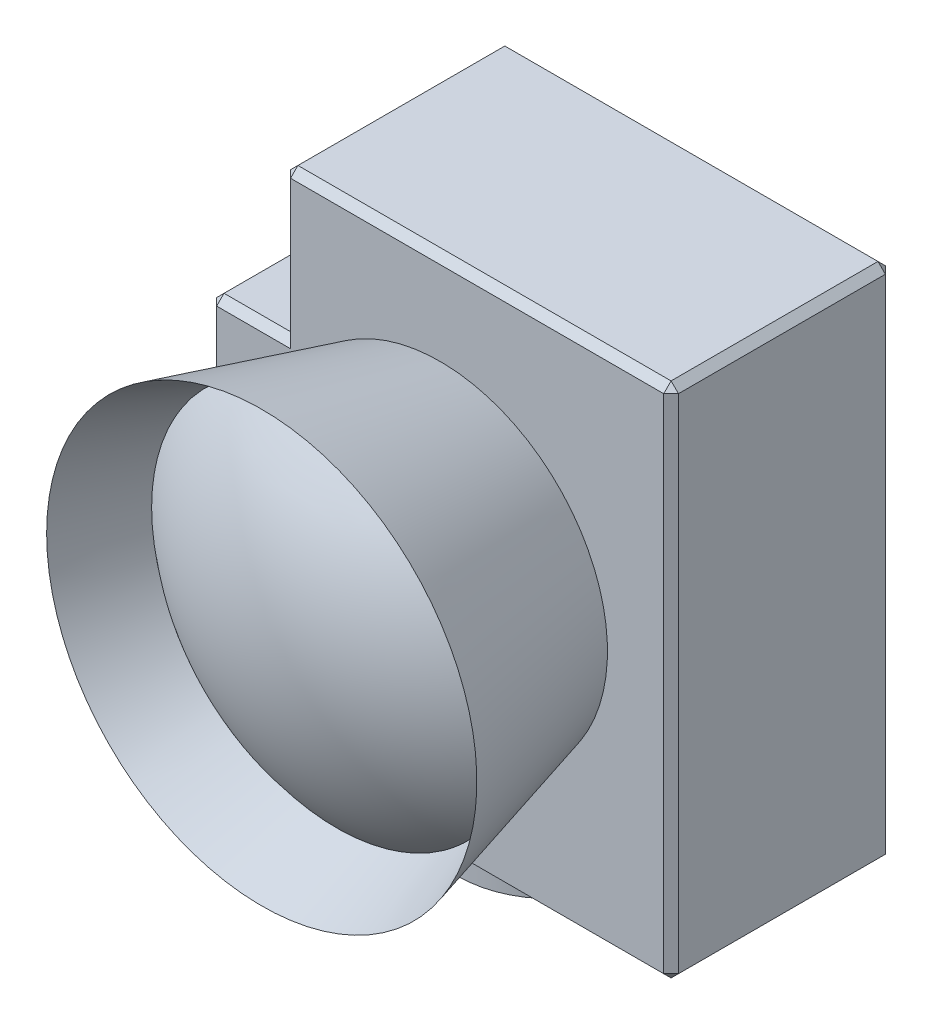
ISO-10303-21;
HEADER;
FILE_DESCRIPTION(('STEP AP214'),'2;1');
FILE_NAME('part.step','',(''),(''),'','','');
FILE_SCHEMA(('AUTOMOTIVE_DESIGN { 1 0 10303 214 1 1 1 1 }'));
ENDSEC;
DATA;
#1=APPLICATION_CONTEXT('core data for automotive mechanical design processes');
#2=APPLICATION_PROTOCOL_DEFINITION('international standard','automotive_design',2000,#1);
#3=PRODUCT_CONTEXT('',#1,'mechanical');
#4=PRODUCT('Part','Part','',(#3));
#5=PRODUCT_RELATED_PRODUCT_CATEGORY('part','',(#4));
#6=PRODUCT_DEFINITION_FORMATION('','',#4);
#7=PRODUCT_DEFINITION_CONTEXT('part definition',#1,'design');
#8=PRODUCT_DEFINITION('design','',#6,#7);
#9=PRODUCT_DEFINITION_SHAPE('','',#8);
#10=(LENGTH_UNIT() NAMED_UNIT(*) SI_UNIT(.MILLI.,.METRE.));
#11=(NAMED_UNIT(*) PLANE_ANGLE_UNIT() SI_UNIT($,.RADIAN.));
#12=(NAMED_UNIT(*) SI_UNIT($,.STERADIAN.) SOLID_ANGLE_UNIT());
#13=UNCERTAINTY_MEASURE_WITH_UNIT(LENGTH_MEASURE(1.E-05),#10,'distance_accuracy_value','');
#14=(GEOMETRIC_REPRESENTATION_CONTEXT(3) GLOBAL_UNCERTAINTY_ASSIGNED_CONTEXT((#13)) GLOBAL_UNIT_ASSIGNED_CONTEXT((#10,
#11,#12)) REPRESENTATION_CONTEXT('',''));
#15=CARTESIAN_POINT('',(0.,0.,0.));
#16=DIRECTION('',(0.,0.,1.));
#17=DIRECTION('',(1.,0.,0.));
#18=AXIS2_PLACEMENT_3D('',#15,#16,#17);
#19=CARTESIAN_POINT('',(0.,0.,33.7501562772454));
#20=CARTESIAN_POINT('',(-12.5291399374517,0.,33.7501562772454));
#21=CARTESIAN_POINT('',(-25.0582798749034,0.,28.9933194314533));
#22=B_SPLINE_CURVE_WITH_KNOTS('',2,(#19,#20,#21),.UNSPECIFIED.,.F.,.F.,(3,3),(0.,0.5),.UNSPECIFIED.);
#23=CARTESIAN_POINT('',(0.,0.,0.));
#24=DIRECTION('',(0.,0.,-1.));
#25=AXIS1_PLACEMENT('',#23,#24);
#26=SURFACE_OF_REVOLUTION('',#22,#25);
#27=CARTESIAN_POINT('',(0.,0.,28.9933194314533));
#28=DIRECTION('',(0.,0.,-1.));
#29=DIRECTION('',(-1.,0.,0.));
#30=AXIS2_PLACEMENT_3D('',#27,#28,#29);
#31=CIRCLE('',#30,25.0582798749034);
#32=CARTESIAN_POINT('',(-25.0582798749034,0.,28.9933194314533));
#33=VERTEX_POINT('',#32);
#34=EDGE_CURVE('E12',#33,#33,#31,.T.);
#35=ORIENTED_EDGE('',*,*,#34,.T.);
#36=EDGE_LOOP('',(#35));
#37=FACE_BOUND('',#36,.T.);
#38=CARTESIAN_POINT('',(0.,0.,33.7501562772454));
#39=VERTEX_POINT('',#38);
#40=VERTEX_LOOP('',#39);
#41=FACE_BOUND('',#40,.T.);
#42=ADVANCED_FACE('F49',(#37,#41),#26,.F.);
#43=CARTESIAN_POINT('',(0.,0.,0.));
#44=DIRECTION('',(0.,0.,-1.));
#45=DIRECTION('',(-1.,0.,0.));
#46=AXIS2_PLACEMENT_3D('',#43,#44,#45);
#47=SPHERICAL_SURFACE('',#46,38.3214034443322);
#48=ORIENTED_EDGE('',*,*,#34,.F.);
#49=EDGE_LOOP('',(#48));
#50=FACE_BOUND('',#49,.T.);
#51=ADVANCED_FACE('F58',(#50),#47,.T.);
#52=CLOSED_SHELL('',(#42,#51));
#53=MANIFOLD_SOLID_BREP('B2',#52);
#54=CARTESIAN_POINT('',(-31.25,15.,15.));
#55=DIRECTION('',(1.,0.,0.));
#56=DIRECTION('',(0.,1.,0.));
#57=AXIS2_PLACEMENT_3D('',#54,#55,#56);
#58=PLANE('',#57);
#59=DIRECTION('',(0.,0.,-1.));
#60=VECTOR('',#59,1.);
#61=CARTESIAN_POINT('',(-31.25,14.,15.));
#62=LINE('',#61,#60);
#63=CARTESIAN_POINT('',(-31.25,14.,14.));
#64=VERTEX_POINT('',#63);
#65=CARTESIAN_POINT('',(-31.25,14.,-14.));
#66=VERTEX_POINT('',#65);
#67=EDGE_CURVE('E98',#64,#66,#62,.T.);
#68=ORIENTED_EDGE('',*,*,#67,.T.);
#69=DIRECTION('',(0.,-1.,0.));
#70=VECTOR('',#69,1.);
#71=CARTESIAN_POINT('',(-31.25,-35.,-14.));
#72=LINE('',#71,#70);
#73=CARTESIAN_POINT('',(-31.25,-35.,-14.));
#74=VERTEX_POINT('',#73);
#75=EDGE_CURVE('E47',#66,#74,#72,.T.);
#76=ORIENTED_EDGE('',*,*,#75,.T.);
#77=DIRECTION('',(0.,0.,-1.));
#78=VECTOR('',#77,1.);
#79=CARTESIAN_POINT('',(-31.25,-35.,15.));
#80=LINE('',#79,#78);
#81=CARTESIAN_POINT('',(-31.25,-35.,14.));
#82=VERTEX_POINT('',#81);
#83=EDGE_CURVE('E374',#82,#74,#80,.T.);
#84=ORIENTED_EDGE('',*,*,#83,.F.);
#85=DIRECTION('',(0.,1.,0.));
#86=VECTOR('',#85,1.);
#87=CARTESIAN_POINT('',(-31.25,15.,14.));
#88=LINE('',#87,#86);
#89=EDGE_CURVE('E109',#82,#64,#88,.T.);
#90=ORIENTED_EDGE('',*,*,#89,.T.);
#91=EDGE_LOOP('',(#68,#76,#84,#90));
#92=FACE_BOUND('',#91,.T.);
#93=ADVANCED_FACE('F88',(#92),#58,.F.);
#94=CARTESIAN_POINT('',(31.25,-35.,15.));
#95=DIRECTION('',(0.,1.,0.));
#96=DIRECTION('',(0.,0.,1.));
#97=AXIS2_PLACEMENT_3D('',#94,#95,#96);
#98=PLANE('',#97);
#99=CARTESIAN_POINT('',(0.,-35.,0.));
#100=DIRECTION('',(0.,1.,0.));
#101=DIRECTION('',(0.,0.,1.));
#102=AXIS2_PLACEMENT_3D('',#99,#100,#101);
#103=CIRCLE('',#102,12.5);
#104=CARTESIAN_POINT('',(0.,-35.,12.5));
#105=VERTEX_POINT('',#104);
#106=EDGE_CURVE('E232',#105,#105,#103,.F.);
#107=ORIENTED_EDGE('',*,*,#106,.F.);
#108=EDGE_LOOP('',(#107));
#109=FACE_BOUND('',#108,.T.);
#110=ORIENTED_EDGE('',*,*,#83,.T.);
#111=DIRECTION('',(1.,0.,0.));
#112=VECTOR('',#111,1.);
#113=CARTESIAN_POINT('',(31.25,-35.,-14.));
#114=LINE('',#113,#112);
#115=CARTESIAN_POINT('',(30.25,-35.,-14.));
#116=VERTEX_POINT('',#115);
#117=EDGE_CURVE('E245',#74,#116,#114,.T.);
#118=ORIENTED_EDGE('',*,*,#117,.T.);
#119=DIRECTION('',(0.,0.,1.));
#120=VECTOR('',#119,1.);
#121=CARTESIAN_POINT('',(30.25,-35.,15.));
#122=LINE('',#121,#120);
#123=CARTESIAN_POINT('',(30.25,-35.,14.));
#124=VERTEX_POINT('',#123);
#125=EDGE_CURVE('E208',#116,#124,#122,.T.);
#126=ORIENTED_EDGE('',*,*,#125,.T.);
#127=DIRECTION('',(-1.,0.,0.));
#128=VECTOR('',#127,1.);
#129=CARTESIAN_POINT('',(31.25,-35.,14.));
#130=LINE('',#129,#128);
#131=EDGE_CURVE('E239',#124,#82,#130,.T.);
#132=ORIENTED_EDGE('',*,*,#131,.T.);
#133=EDGE_LOOP('',(#110,#118,#126,#132));
#134=FACE_BOUND('',#133,.T.);
#135=ADVANCED_FACE('F386',(#109,#134),#98,.F.);
#136=CARTESIAN_POINT('',(31.25,34.9819920704579,15.));
#137=DIRECTION('',(-1.,0.,0.));
#138=DIRECTION('',(0.,-1.,0.));
#139=AXIS2_PLACEMENT_3D('',#136,#137,#138);
#140=PLANE('',#139);
#141=DIRECTION('',(0.,0.,1.));
#142=VECTOR('',#141,1.);
#143=CARTESIAN_POINT('',(31.25,33.9819920704579,15.));
#144=LINE('',#143,#142);
#145=CARTESIAN_POINT('',(31.25,33.9819920704579,-14.));
#146=VERTEX_POINT('',#145);
#147=CARTESIAN_POINT('',(31.25,33.9819920704579,14.));
#148=VERTEX_POINT('',#147);
#149=EDGE_CURVE('E231',#146,#148,#144,.T.);
#150=ORIENTED_EDGE('',*,*,#149,.T.);
#151=DIRECTION('',(0.,-1.,0.));
#152=VECTOR('',#151,1.);
#153=CARTESIAN_POINT('',(31.25,34.9819920704579,14.));
#154=LINE('',#153,#152);
#155=CARTESIAN_POINT('',(31.25,-34.,14.));
#156=VERTEX_POINT('',#155);
#157=EDGE_CURVE('E236',#148,#156,#154,.T.);
#158=ORIENTED_EDGE('',*,*,#157,.T.);
#159=DIRECTION('',(0.,0.,-1.));
#160=VECTOR('',#159,1.);
#161=CARTESIAN_POINT('',(31.25,-34.,15.));
#162=LINE('',#161,#160);
#163=CARTESIAN_POINT('',(31.25,-34.,-14.));
#164=VERTEX_POINT('',#163);
#165=EDGE_CURVE('E206',#156,#164,#162,.T.);
#166=ORIENTED_EDGE('',*,*,#165,.T.);
#167=DIRECTION('',(0.,1.,0.));
#168=VECTOR('',#167,1.);
#169=CARTESIAN_POINT('',(31.25,34.9819920704579,-14.));
#170=LINE('',#169,#168);
#171=EDGE_CURVE('E225',#164,#146,#170,.T.);
#172=ORIENTED_EDGE('',*,*,#171,.T.);
#173=EDGE_LOOP('',(#150,#158,#166,#172));
#174=FACE_BOUND('',#173,.T.);
#175=ADVANCED_FACE('F234',(#174),#140,.F.);
#176=CARTESIAN_POINT('',(31.25,34.9819920704579,15.));
#177=DIRECTION('',(0.,-1.,0.));
#178=DIRECTION('',(1.,0.,0.));
#179=AXIS2_PLACEMENT_3D('',#176,#177,#178);
#180=PLANE('',#179);
#181=DIRECTION('',(1.,0.,0.));
#182=VECTOR('',#181,1.);
#183=CARTESIAN_POINT('',(31.25,34.9819920704579,14.));
#184=LINE('',#183,#182);
#185=CARTESIAN_POINT('',(-20.25,34.9819920704579,14.));
#186=VERTEX_POINT('',#185);
#187=CARTESIAN_POINT('',(30.25,34.9819920704579,14.));
#188=VERTEX_POINT('',#187);
#189=EDGE_CURVE('E247',#186,#188,#184,.T.);
#190=ORIENTED_EDGE('',*,*,#189,.T.);
#191=DIRECTION('',(0.,0.,-1.));
#192=VECTOR('',#191,1.);
#193=CARTESIAN_POINT('',(30.25,34.9819920704579,15.));
#194=LINE('',#193,#192);
#195=CARTESIAN_POINT('',(30.25,34.9819920704579,-14.));
#196=VERTEX_POINT('',#195);
#197=EDGE_CURVE('E253',#188,#196,#194,.T.);
#198=ORIENTED_EDGE('',*,*,#197,.T.);
#199=DIRECTION('',(-1.,0.,0.));
#200=VECTOR('',#199,1.);
#201=CARTESIAN_POINT('',(-21.25,34.9819920704579,-14.));
#202=LINE('',#201,#200);
#203=CARTESIAN_POINT('',(-20.25,34.9819920704579,-14.));
#204=VERTEX_POINT('',#203);
#205=EDGE_CURVE('E251',#196,#204,#202,.T.);
#206=ORIENTED_EDGE('',*,*,#205,.T.);
#207=DIRECTION('',(0.,0.,1.));
#208=VECTOR('',#207,1.);
#209=CARTESIAN_POINT('',(-20.25,34.9819920704579,15.));
#210=LINE('',#209,#208);
#211=EDGE_CURVE('E249',#204,#186,#210,.T.);
#212=ORIENTED_EDGE('',*,*,#211,.T.);
#213=EDGE_LOOP('',(#190,#198,#206,#212));
#214=FACE_BOUND('',#213,.T.);
#215=ADVANCED_FACE('F465',(#214),#180,.F.);
#216=CARTESIAN_POINT('',(-21.25,34.9819920704579,15.));
#217=DIRECTION('',(1.,0.,0.));
#218=DIRECTION('',(0.,0.,-1.));
#219=AXIS2_PLACEMENT_3D('',#216,#217,#218);
#220=PLANE('',#219);
#221=DIRECTION('',(0.,0.,-1.));
#222=VECTOR('',#221,1.);
#223=CARTESIAN_POINT('',(-21.25,33.9819920704579,15.));
#224=LINE('',#223,#222);
#225=CARTESIAN_POINT('',(-21.25,33.9819920704579,14.));
#226=VERTEX_POINT('',#225);
#227=CARTESIAN_POINT('',(-21.25,33.9819920704579,-14.));
#228=VERTEX_POINT('',#227);
#229=EDGE_CURVE('E291',#226,#228,#224,.T.);
#230=ORIENTED_EDGE('',*,*,#229,.T.);
#231=DIRECTION('',(0.,-1.,0.));
#232=VECTOR('',#231,1.);
#233=CARTESIAN_POINT('',(-21.25,15.,-14.));
#234=LINE('',#233,#232);
#235=CARTESIAN_POINT('',(-21.25,15.,-14.));
#236=VERTEX_POINT('',#235);
#237=EDGE_CURVE('E293',#228,#236,#234,.T.);
#238=ORIENTED_EDGE('',*,*,#237,.T.);
#239=DIRECTION('',(0.,0.,-1.));
#240=VECTOR('',#239,1.);
#241=CARTESIAN_POINT('',(-21.25,15.,15.));
#242=LINE('',#241,#240);
#243=CARTESIAN_POINT('',(-21.25,15.,14.));
#244=VERTEX_POINT('',#243);
#245=EDGE_CURVE('E369',#244,#236,#242,.T.);
#246=ORIENTED_EDGE('',*,*,#245,.F.);
#247=DIRECTION('',(0.,1.,0.));
#248=VECTOR('',#247,1.);
#249=CARTESIAN_POINT('',(-21.25,34.9819920704579,14.));
#250=LINE('',#249,#248);
#251=EDGE_CURVE('E289',#244,#226,#250,.T.);
#252=ORIENTED_EDGE('',*,*,#251,.T.);
#253=EDGE_LOOP('',(#230,#238,#246,#252));
#254=FACE_BOUND('',#253,.T.);
#255=ADVANCED_FACE('F478',(#254),#220,.F.);
#256=CARTESIAN_POINT('',(-31.25,15.,15.));
#257=DIRECTION('',(0.,-1.,0.));
#258=DIRECTION('',(1.,0.,0.));
#259=AXIS2_PLACEMENT_3D('',#256,#257,#258);
#260=PLANE('',#259);
#261=ORIENTED_EDGE('',*,*,#245,.T.);
#262=DIRECTION('',(-1.,0.,0.));
#263=VECTOR('',#262,1.);
#264=CARTESIAN_POINT('',(-31.25,15.,-14.));
#265=LINE('',#264,#263);
#266=CARTESIAN_POINT('',(-30.25,15.,-14.));
#267=VERTEX_POINT('',#266);
#268=EDGE_CURVE('E286',#236,#267,#265,.T.);
#269=ORIENTED_EDGE('',*,*,#268,.T.);
#270=DIRECTION('',(0.,0.,1.));
#271=VECTOR('',#270,1.);
#272=CARTESIAN_POINT('',(-30.25,15.,15.));
#273=LINE('',#272,#271);
#274=CARTESIAN_POINT('',(-30.25,15.,14.));
#275=VERTEX_POINT('',#274);
#276=EDGE_CURVE('E284',#267,#275,#273,.T.);
#277=ORIENTED_EDGE('',*,*,#276,.T.);
#278=DIRECTION('',(1.,0.,0.));
#279=VECTOR('',#278,1.);
#280=CARTESIAN_POINT('',(-31.25,15.,14.));
#281=LINE('',#280,#279);
#282=EDGE_CURVE('E282',#275,#244,#281,.T.);
#283=ORIENTED_EDGE('',*,*,#282,.T.);
#284=EDGE_LOOP('',(#261,#269,#277,#283));
#285=FACE_BOUND('',#284,.T.);
#286=ADVANCED_FACE('F475',(#285),#260,.F.);
#287=CARTESIAN_POINT('',(0.,0.,15.));
#288=DIRECTION('',(0.,0.,-1.));
#289=DIRECTION('',(-1.,0.,0.));
#290=AXIS2_PLACEMENT_3D('',#287,#288,#289);
#291=PLANE('',#290);
#292=CARTESIAN_POINT('',(0.,0.,15.));
#293=DIRECTION('',(0.,0.,-1.));
#294=DIRECTION('',(-1.,0.,0.));
#295=AXIS2_PLACEMENT_3D('',#292,#293,#294);
#296=CIRCLE('',#295,22.6402714347078);
#297=CARTESIAN_POINT('',(-22.6402714347078,0.,15.));
#298=VERTEX_POINT('',#297);
#299=EDGE_CURVE('E931',#298,#298,#296,.T.);
#300=ORIENTED_EDGE('',*,*,#299,.T.);
#301=EDGE_LOOP('',(#300));
#302=FACE_BOUND('',#301,.T.);
#303=DIRECTION('',(1.,0.,0.));
#304=VECTOR('',#303,1.);
#305=CARTESIAN_POINT('',(0.,-34.,15.));
#306=LINE('',#305,#304);
#307=CARTESIAN_POINT('',(-30.25,-34.,15.));
#308=VERTEX_POINT('',#307);
#309=CARTESIAN_POINT('',(30.25,-34.,15.));
#310=VERTEX_POINT('',#309);
#311=EDGE_CURVE('E256',#308,#310,#306,.T.);
#312=ORIENTED_EDGE('',*,*,#311,.T.);
#313=DIRECTION('',(0.,1.,0.));
#314=VECTOR('',#313,1.);
#315=CARTESIAN_POINT('',(30.25,0.,15.));
#316=LINE('',#315,#314);
#317=CARTESIAN_POINT('',(30.25,33.9819920704579,15.));
#318=VERTEX_POINT('',#317);
#319=EDGE_CURVE('E266',#310,#318,#316,.T.);
#320=ORIENTED_EDGE('',*,*,#319,.T.);
#321=DIRECTION('',(-1.,0.,0.));
#322=VECTOR('',#321,1.);
#323=CARTESIAN_POINT('',(0.,33.9819920704579,15.));
#324=LINE('',#323,#322);
#325=CARTESIAN_POINT('',(-20.25,33.9819920704579,15.));
#326=VERTEX_POINT('',#325);
#327=EDGE_CURVE('E264',#318,#326,#324,.T.);
#328=ORIENTED_EDGE('',*,*,#327,.T.);
#329=DIRECTION('',(0.,-1.,0.));
#330=VECTOR('',#329,1.);
#331=CARTESIAN_POINT('',(-20.25,0.,15.));
#332=LINE('',#331,#330);
#333=CARTESIAN_POINT('',(-20.25,14.,15.));
#334=VERTEX_POINT('',#333);
#335=EDGE_CURVE('E262',#326,#334,#332,.T.);
#336=ORIENTED_EDGE('',*,*,#335,.T.);
#337=DIRECTION('',(-1.,0.,0.));
#338=VECTOR('',#337,1.);
#339=CARTESIAN_POINT('',(0.,14.,15.));
#340=LINE('',#339,#338);
#341=CARTESIAN_POINT('',(-30.25,14.,15.));
#342=VERTEX_POINT('',#341);
#343=EDGE_CURVE('E260',#334,#342,#340,.T.);
#344=ORIENTED_EDGE('',*,*,#343,.T.);
#345=DIRECTION('',(0.,-1.,0.));
#346=VECTOR('',#345,1.);
#347=CARTESIAN_POINT('',(-30.25,0.,15.));
#348=LINE('',#347,#346);
#349=EDGE_CURVE('E258',#342,#308,#348,.T.);
#350=ORIENTED_EDGE('',*,*,#349,.T.);
#351=EDGE_LOOP('',(#312,#320,#328,#336,#344,#350));
#352=FACE_BOUND('',#351,.T.);
#353=ADVANCED_FACE('F471',(#302,#352),#291,.F.);
#354=CARTESIAN_POINT('',(0.,0.,-15.));
#355=DIRECTION('',(0.,0.,-1.));
#356=DIRECTION('',(-1.,0.,0.));
#357=AXIS2_PLACEMENT_3D('',#354,#355,#356);
#358=PLANE('',#357);
#359=DIRECTION('',(1.,0.,0.));
#360=VECTOR('',#359,1.);
#361=CARTESIAN_POINT('',(31.25,33.9819920704579,-15.));
#362=LINE('',#361,#360);
#363=CARTESIAN_POINT('',(-20.25,33.9819920704579,-15.));
#364=VERTEX_POINT('',#363);
#365=CARTESIAN_POINT('',(30.25,33.9819920704579,-15.));
#366=VERTEX_POINT('',#365);
#367=EDGE_CURVE('E278',#364,#366,#362,.T.);
#368=ORIENTED_EDGE('',*,*,#367,.T.);
#369=DIRECTION('',(0.,-1.,0.));
#370=VECTOR('',#369,1.);
#371=CARTESIAN_POINT('',(30.25,-35.,-15.));
#372=LINE('',#371,#370);
#373=CARTESIAN_POINT('',(30.25,-34.,-15.));
#374=VERTEX_POINT('',#373);
#375=EDGE_CURVE('E280',#366,#374,#372,.T.);
#376=ORIENTED_EDGE('',*,*,#375,.T.);
#377=DIRECTION('',(-1.,0.,0.));
#378=VECTOR('',#377,1.);
#379=CARTESIAN_POINT('',(-31.25,-34.,-15.));
#380=LINE('',#379,#378);
#381=CARTESIAN_POINT('',(-30.25,-34.,-15.));
#382=VERTEX_POINT('',#381);
#383=EDGE_CURVE('E273',#374,#382,#380,.T.);
#384=ORIENTED_EDGE('',*,*,#383,.T.);
#385=DIRECTION('',(0.,1.,0.));
#386=VECTOR('',#385,1.);
#387=CARTESIAN_POINT('',(-30.25,15.,-15.));
#388=LINE('',#387,#386);
#389=CARTESIAN_POINT('',(-30.25,14.,-15.));
#390=VERTEX_POINT('',#389);
#391=EDGE_CURVE('E269',#382,#390,#388,.T.);
#392=ORIENTED_EDGE('',*,*,#391,.T.);
#393=DIRECTION('',(1.,0.,0.));
#394=VECTOR('',#393,1.);
#395=CARTESIAN_POINT('',(-21.25,14.,-15.));
#396=LINE('',#395,#394);
#397=CARTESIAN_POINT('',(-20.25,14.,-15.));
#398=VERTEX_POINT('',#397);
#399=EDGE_CURVE('E271',#390,#398,#396,.T.);
#400=ORIENTED_EDGE('',*,*,#399,.T.);
#401=DIRECTION('',(0.,1.,0.));
#402=VECTOR('',#401,1.);
#403=CARTESIAN_POINT('',(-20.25,34.9819920704579,-15.));
#404=LINE('',#403,#402);
#405=EDGE_CURVE('E276',#398,#364,#404,.T.);
#406=ORIENTED_EDGE('',*,*,#405,.T.);
#407=EDGE_LOOP('',(#368,#376,#384,#392,#400,#406));
#408=FACE_BOUND('',#407,.T.);
#409=ADVANCED_FACE('F401',(#408),#358,.T.);
#410=CARTESIAN_POINT('',(0.,-39.,0.));
#411=DIRECTION('',(0.,1.,0.));
#412=DIRECTION('',(0.,0.,1.));
#413=AXIS2_PLACEMENT_3D('',#410,#411,#412);
#414=CYLINDRICAL_SURFACE('',#413,12.5);
#415=CARTESIAN_POINT('',(0.,-39.,0.));
#416=DIRECTION('',(0.,-1.,0.));
#417=DIRECTION('',(0.,0.,-1.));
#418=AXIS2_PLACEMENT_3D('',#415,#416,#417);
#419=CIRCLE('',#418,12.5);
#420=CARTESIAN_POINT('',(0.,-39.,-12.5));
#421=VERTEX_POINT('',#420);
#422=EDGE_CURVE('E363',#421,#421,#419,.T.);
#423=ORIENTED_EDGE('',*,*,#422,.F.);
#424=EDGE_LOOP('',(#423));
#425=FACE_BOUND('',#424,.T.);
#426=ORIENTED_EDGE('',*,*,#106,.T.);
#427=EDGE_LOOP('',(#426));
#428=FACE_BOUND('',#427,.T.);
#429=ADVANCED_FACE('F384',(#425,#428),#414,.T.);
#430=CARTESIAN_POINT('',(0.,-39.,0.));
#431=DIRECTION('',(0.,-1.,0.));
#432=DIRECTION('',(0.,0.,-1.));
#433=AXIS2_PLACEMENT_3D('',#430,#431,#432);
#434=PLANE('',#433);
#435=ORIENTED_EDGE('',*,*,#422,.T.);
#436=EDGE_LOOP('',(#435));
#437=FACE_BOUND('',#436,.T.);
#438=ADVANCED_FACE('F608',(#437),#434,.T.);
#439=CARTESIAN_POINT('',(-20.25,0.,15.));
#440=DIRECTION('',(0.707106781186547,0.,-0.707106781186547));
#441=DIRECTION('',(0.,-1.,0.));
#442=AXIS2_PLACEMENT_3D('',#439,#440,#441);
#443=PLANE('',#442);
#444=DIRECTION('',(-0.707106781186547,0.,-0.707106781186547));
#445=VECTOR('',#444,1.);
#446=CARTESIAN_POINT('',(-20.75,33.9819920704579,14.5));
#447=LINE('',#446,#445);
#448=EDGE_CURVE('E357',#226,#326,#447,.F.);
#449=ORIENTED_EDGE('',*,*,#448,.F.);
#450=ORIENTED_EDGE('',*,*,#251,.F.);
#451=DIRECTION('',(-0.577350269189625,0.577350269189626,-0.577350269189625));
#452=VECTOR('',#451,1.);
#453=CARTESIAN_POINT('',(-15.5833333333333,9.33333333333332,19.6666666666667));
#454=LINE('',#453,#452);
#455=EDGE_CURVE('E93',#334,#244,#454,.T.);
#456=ORIENTED_EDGE('',*,*,#455,.F.);
#457=ORIENTED_EDGE('',*,*,#335,.F.);
#458=EDGE_LOOP('',(#449,#450,#456,#457));
#459=FACE_BOUND('',#458,.T.);
#460=ADVANCED_FACE('F91',(#459),#443,.F.);
#461=CARTESIAN_POINT('',(-21.25,33.9819920704579,15.));
#462=DIRECTION('',(0.707106781186547,-0.707106781186547,0.));
#463=DIRECTION('',(0.,0.,-1.));
#464=AXIS2_PLACEMENT_3D('',#461,#462,#463);
#465=PLANE('',#464);
#466=DIRECTION('',(-0.707106781186547,-0.707106781186547,0.));
#467=VECTOR('',#466,1.);
#468=CARTESIAN_POINT('',(-20.25,34.9819920704579,-14.));
#469=LINE('',#468,#467);
#470=EDGE_CURVE('E352',#228,#204,#469,.F.);
#471=ORIENTED_EDGE('',*,*,#470,.F.);
#472=ORIENTED_EDGE('',*,*,#229,.F.);
#473=DIRECTION('',(0.707106781186547,0.707106781186547,0.));
#474=VECTOR('',#473,1.);
#475=CARTESIAN_POINT('',(-20.25,34.9819920704579,14.));
#476=LINE('',#475,#474);
#477=EDGE_CURVE('E355',#186,#226,#476,.F.);
#478=ORIENTED_EDGE('',*,*,#477,.F.);
#479=ORIENTED_EDGE('',*,*,#211,.F.);
#480=EDGE_LOOP('',(#471,#472,#478,#479));
#481=FACE_BOUND('',#480,.T.);
#482=ADVANCED_FACE('F462',(#481),#465,.F.);
#483=CARTESIAN_POINT('',(-21.25,34.9819920704579,-14.));
#484=DIRECTION('',(-0.707106781186547,0.,-0.707106781186547));
#485=DIRECTION('',(0.,1.,0.));
#486=AXIS2_PLACEMENT_3D('',#483,#484,#485);
#487=PLANE('',#486);
#488=DIRECTION('',(-0.577350269189625,0.577350269189626,0.577350269189625));
#489=VECTOR('',#488,1.);
#490=CARTESIAN_POINT('',(-24.5833333333333,18.3333333333333,-10.6666666666667));
#491=LINE('',#490,#489);
#492=EDGE_CURVE('E346',#236,#398,#491,.F.);
#493=ORIENTED_EDGE('',*,*,#492,.F.);
#494=ORIENTED_EDGE('',*,*,#237,.F.);
#495=DIRECTION('',(-0.707106781186547,0.,0.707106781186547));
#496=VECTOR('',#495,1.);
#497=CARTESIAN_POINT('',(-20.75,33.9819920704579,-14.5));
#498=LINE('',#497,#496);
#499=EDGE_CURVE('E349',#364,#228,#498,.T.);
#500=ORIENTED_EDGE('',*,*,#499,.F.);
#501=ORIENTED_EDGE('',*,*,#405,.F.);
#502=EDGE_LOOP('',(#493,#494,#500,#501));
#503=FACE_BOUND('',#502,.T.);
#504=ADVANCED_FACE('F453',(#503),#487,.T.);
#505=CARTESIAN_POINT('',(0.,14.,15.));
#506=DIRECTION('',(0.,-0.707106781186547,-0.707106781186548));
#507=DIRECTION('',(-1.,0.,0.));
#508=AXIS2_PLACEMENT_3D('',#505,#506,#507);
#509=PLANE('',#508);
#510=ORIENTED_EDGE('',*,*,#455,.T.);
#511=ORIENTED_EDGE('',*,*,#282,.F.);
#512=DIRECTION('',(0.,-0.707106781186548,0.707106781186547));
#513=VECTOR('',#512,1.);
#514=CARTESIAN_POINT('',(-30.25,15.,14.));
#515=LINE('',#514,#513);
#516=EDGE_CURVE('E340',#342,#275,#515,.F.);
#517=ORIENTED_EDGE('',*,*,#516,.F.);
#518=ORIENTED_EDGE('',*,*,#343,.F.);
#519=EDGE_LOOP('',(#510,#511,#517,#518));
#520=FACE_BOUND('',#519,.T.);
#521=ADVANCED_FACE('F472',(#520),#509,.F.);
#522=CARTESIAN_POINT('',(-20.25,34.9819920704579,14.));
#523=DIRECTION('',(-0.577350269189626,0.577350269189626,0.577350269189626));
#524=DIRECTION('',(0.707106781186547,0.,0.707106781186547));
#525=AXIS2_PLACEMENT_3D('',#522,#523,#524);
#526=PLANE('',#525);
#527=ORIENTED_EDGE('',*,*,#477,.T.);
#528=ORIENTED_EDGE('',*,*,#448,.T.);
#529=DIRECTION('',(0.,-0.707106781186547,0.707106781186548));
#530=VECTOR('',#529,1.);
#531=CARTESIAN_POINT('',(-20.25,34.9819920704579,14.));
#532=LINE('',#531,#530);
#533=EDGE_CURVE('E337',#186,#326,#532,.T.);
#534=ORIENTED_EDGE('',*,*,#533,.F.);
#535=EDGE_LOOP('',(#527,#528,#534));
#536=FACE_BOUND('',#535,.T.);
#537=ADVANCED_FACE('F480',(#536),#526,.T.);
#538=CARTESIAN_POINT('',(-20.25,34.9819920704579,-14.));
#539=DIRECTION('',(-0.577350269189626,0.577350269189626,-0.577350269189626));
#540=DIRECTION('',(-0.707106781186547,0.,0.707106781186547));
#541=AXIS2_PLACEMENT_3D('',#538,#539,#540);
#542=PLANE('',#541);
#543=ORIENTED_EDGE('',*,*,#499,.T.);
#544=ORIENTED_EDGE('',*,*,#470,.T.);
#545=DIRECTION('',(0.,-0.707106781186547,-0.707106781186548));
#546=VECTOR('',#545,1.);
#547=CARTESIAN_POINT('',(-20.25,34.9819920704579,-14.));
#548=LINE('',#547,#546);
#549=EDGE_CURVE('E334',#364,#204,#548,.F.);
#550=ORIENTED_EDGE('',*,*,#549,.F.);
#551=EDGE_LOOP('',(#543,#544,#550));
#552=FACE_BOUND('',#551,.T.);
#553=ADVANCED_FACE('F458',(#552),#542,.T.);
#554=CARTESIAN_POINT('',(-31.25,15.,-14.));
#555=DIRECTION('',(0.,0.707106781186547,-0.707106781186548));
#556=DIRECTION('',(1.,0.,0.));
#557=AXIS2_PLACEMENT_3D('',#554,#555,#556);
#558=PLANE('',#557);
#559=ORIENTED_EDGE('',*,*,#492,.T.);
#560=ORIENTED_EDGE('',*,*,#399,.F.);
#561=DIRECTION('',(0.,-0.707106781186548,-0.707106781186547));
#562=VECTOR('',#561,1.);
#563=CARTESIAN_POINT('',(-30.25,15.,-14.));
#564=LINE('',#563,#562);
#565=EDGE_CURVE('E331',#267,#390,#564,.T.);
#566=ORIENTED_EDGE('',*,*,#565,.F.);
#567=ORIENTED_EDGE('',*,*,#268,.F.);
#568=EDGE_LOOP('',(#559,#560,#566,#567));
#569=FACE_BOUND('',#568,.T.);
#570=ADVANCED_FACE('F450',(#569),#558,.T.);
#571=CARTESIAN_POINT('',(-31.25,14.,15.));
#572=DIRECTION('',(0.707106781186547,-0.707106781186547,0.));
#573=DIRECTION('',(0.,0.,-1.));
#574=AXIS2_PLACEMENT_3D('',#571,#572,#573);
#575=PLANE('',#574);
#576=DIRECTION('',(0.707106781186547,0.707106781186547,0.));
#577=VECTOR('',#576,1.);
#578=CARTESIAN_POINT('',(-30.25,15.,14.));
#579=LINE('',#578,#577);
#580=EDGE_CURVE('E343',#275,#64,#579,.F.);
#581=ORIENTED_EDGE('',*,*,#580,.F.);
#582=ORIENTED_EDGE('',*,*,#276,.F.);
#583=DIRECTION('',(-0.707106781186547,-0.707106781186547,0.));
#584=VECTOR('',#583,1.);
#585=CARTESIAN_POINT('',(-30.25,15.,-14.));
#586=LINE('',#585,#584);
#587=EDGE_CURVE('E329',#66,#267,#586,.F.);
#588=ORIENTED_EDGE('',*,*,#587,.F.);
#589=ORIENTED_EDGE('',*,*,#67,.F.);
#590=EDGE_LOOP('',(#581,#582,#588,#589));
#591=FACE_BOUND('',#590,.T.);
#592=ADVANCED_FACE('F443',(#591),#575,.F.);
#593=CARTESIAN_POINT('',(-30.25,15.,14.));
#594=DIRECTION('',(-0.577350269189626,0.577350269189626,0.577350269189626));
#595=DIRECTION('',(0.707106781186547,0.,0.707106781186547));
#596=AXIS2_PLACEMENT_3D('',#593,#594,#595);
#597=PLANE('',#596);
#598=ORIENTED_EDGE('',*,*,#516,.T.);
#599=ORIENTED_EDGE('',*,*,#580,.T.);
#600=DIRECTION('',(-0.707106781186548,0.,-0.707106781186547));
#601=VECTOR('',#600,1.);
#602=CARTESIAN_POINT('',(-30.75,14.,14.5));
#603=LINE('',#602,#601);
#604=EDGE_CURVE('E326',#342,#64,#603,.T.);
#605=ORIENTED_EDGE('',*,*,#604,.F.);
#606=EDGE_LOOP('',(#598,#599,#605));
#607=FACE_BOUND('',#606,.T.);
#608=ADVANCED_FACE('F438',(#607),#597,.T.);
#609=CARTESIAN_POINT('',(0.,33.9819920704579,15.));
#610=DIRECTION('',(0.,-0.707106781186548,-0.707106781186547));
#611=DIRECTION('',(-1.,0.,0.));
#612=AXIS2_PLACEMENT_3D('',#609,#610,#611);
#613=PLANE('',#612);
#614=ORIENTED_EDGE('',*,*,#533,.T.);
#615=ORIENTED_EDGE('',*,*,#327,.F.);
#616=DIRECTION('',(0.,0.707106781186547,-0.707106781186548));
#617=VECTOR('',#616,1.);
#618=CARTESIAN_POINT('',(30.25,34.4819920704579,14.5));
#619=LINE('',#618,#617);
#620=EDGE_CURVE('E323',#188,#318,#619,.F.);
#621=ORIENTED_EDGE('',*,*,#620,.F.);
#622=ORIENTED_EDGE('',*,*,#189,.F.);
#623=EDGE_LOOP('',(#614,#615,#621,#622));
#624=FACE_BOUND('',#623,.T.);
#625=ADVANCED_FACE('F468',(#624),#613,.F.);
#626=CARTESIAN_POINT('',(30.25,34.9819920704579,15.));
#627=DIRECTION('',(-0.707106781186547,-0.707106781186547,0.));
#628=DIRECTION('',(0.,0.,-1.));
#629=AXIS2_PLACEMENT_3D('',#626,#627,#628);
#630=PLANE('',#629);
#631=DIRECTION('',(-0.707106781186547,0.707106781186547,0.));
#632=VECTOR('',#631,1.);
#633=CARTESIAN_POINT('',(30.25,34.9819920704579,-14.));
#634=LINE('',#633,#632);
#635=EDGE_CURVE('E317',#196,#146,#634,.F.);
#636=ORIENTED_EDGE('',*,*,#635,.F.);
#637=ORIENTED_EDGE('',*,*,#197,.F.);
#638=DIRECTION('',(0.707106781186547,-0.707106781186547,0.));
#639=VECTOR('',#638,1.);
#640=CARTESIAN_POINT('',(31.25,33.9819920704579,14.));
#641=LINE('',#640,#639);
#642=EDGE_CURVE('E320',#148,#188,#641,.F.);
#643=ORIENTED_EDGE('',*,*,#642,.F.);
#644=ORIENTED_EDGE('',*,*,#149,.F.);
#645=EDGE_LOOP('',(#636,#637,#643,#644));
#646=FACE_BOUND('',#645,.T.);
#647=ADVANCED_FACE('F415',(#646),#630,.F.);
#648=CARTESIAN_POINT('',(31.25,34.9819920704579,-14.));
#649=DIRECTION('',(0.,0.707106781186548,-0.707106781186547));
#650=DIRECTION('',(1.,0.,0.));
#651=AXIS2_PLACEMENT_3D('',#648,#649,#650);
#652=PLANE('',#651);
#653=ORIENTED_EDGE('',*,*,#549,.T.);
#654=ORIENTED_EDGE('',*,*,#205,.F.);
#655=DIRECTION('',(0.,0.707106781186547,0.707106781186548));
#656=VECTOR('',#655,1.);
#657=CARTESIAN_POINT('',(30.25,34.9819920704579,-14.));
#658=LINE('',#657,#656);
#659=EDGE_CURVE('E315',#366,#196,#658,.T.);
#660=ORIENTED_EDGE('',*,*,#659,.F.);
#661=ORIENTED_EDGE('',*,*,#367,.F.);
#662=EDGE_LOOP('',(#653,#654,#660,#661));
#663=FACE_BOUND('',#662,.T.);
#664=ADVANCED_FACE('F409',(#663),#652,.T.);
#665=CARTESIAN_POINT('',(-30.25,15.,-14.));
#666=DIRECTION('',(-0.577350269189626,0.577350269189626,-0.577350269189626));
#667=DIRECTION('',(-0.707106781186547,0.,0.707106781186547));
#668=AXIS2_PLACEMENT_3D('',#665,#666,#667);
#669=PLANE('',#668);
#670=ORIENTED_EDGE('',*,*,#587,.T.);
#671=ORIENTED_EDGE('',*,*,#565,.T.);
#672=DIRECTION('',(-0.707106781186548,0.,0.707106781186547));
#673=VECTOR('',#672,1.);
#674=CARTESIAN_POINT('',(-30.75,14.,-14.5));
#675=LINE('',#674,#673);
#676=EDGE_CURVE('E312',#66,#390,#675,.F.);
#677=ORIENTED_EDGE('',*,*,#676,.F.);
#678=EDGE_LOOP('',(#670,#671,#677));
#679=FACE_BOUND('',#678,.T.);
#680=ADVANCED_FACE('F447',(#679),#669,.T.);
#681=CARTESIAN_POINT('',(-30.25,0.,15.));
#682=DIRECTION('',(0.707106781186547,0.,-0.707106781186548));
#683=DIRECTION('',(0.,-1.,0.));
#684=AXIS2_PLACEMENT_3D('',#681,#682,#683);
#685=PLANE('',#684);
#686=ORIENTED_EDGE('',*,*,#604,.T.);
#687=ORIENTED_EDGE('',*,*,#89,.F.);
#688=DIRECTION('',(-0.577350269189626,-0.577350269189626,-0.577350269189626));
#689=VECTOR('',#688,1.);
#690=CARTESIAN_POINT('',(-20.1666666666667,-23.9166666666667,25.0833333333333));
#691=LINE('',#690,#689);
#692=EDGE_CURVE('E309',#308,#82,#691,.T.);
#693=ORIENTED_EDGE('',*,*,#692,.F.);
#694=ORIENTED_EDGE('',*,*,#349,.F.);
#695=EDGE_LOOP('',(#686,#687,#693,#694));
#696=FACE_BOUND('',#695,.T.);
#697=ADVANCED_FACE('F435',(#696),#685,.F.);
#698=CARTESIAN_POINT('',(31.25,33.9819920704579,14.));
#699=DIRECTION('',(0.577350269189626,0.577350269189626,0.577350269189626));
#700=DIRECTION('',(0.707106781186547,0.,-0.707106781186547));
#701=AXIS2_PLACEMENT_3D('',#698,#699,#700);
#702=PLANE('',#701);
#703=ORIENTED_EDGE('',*,*,#642,.T.);
#704=ORIENTED_EDGE('',*,*,#620,.T.);
#705=DIRECTION('',(-0.707106781186548,0.,0.707106781186548));
#706=VECTOR('',#705,1.);
#707=CARTESIAN_POINT('',(31.25,33.9819920704579,14.));
#708=LINE('',#707,#706);
#709=EDGE_CURVE('E307',#148,#318,#708,.T.);
#710=ORIENTED_EDGE('',*,*,#709,.F.);
#711=EDGE_LOOP('',(#703,#704,#710));
#712=FACE_BOUND('',#711,.T.);
#713=ADVANCED_FACE('F420',(#712),#702,.T.);
#714=CARTESIAN_POINT('',(30.25,34.9819920704579,-14.));
#715=DIRECTION('',(0.577350269189626,0.577350269189626,-0.577350269189626));
#716=DIRECTION('',(-0.707106781186547,0.,-0.707106781186547));
#717=AXIS2_PLACEMENT_3D('',#714,#715,#716);
#718=PLANE('',#717);
#719=ORIENTED_EDGE('',*,*,#659,.T.);
#720=ORIENTED_EDGE('',*,*,#635,.T.);
#721=DIRECTION('',(-0.707106781186548,0.,-0.707106781186548));
#722=VECTOR('',#721,1.);
#723=CARTESIAN_POINT('',(30.75,33.9819920704579,-14.5));
#724=LINE('',#723,#722);
#725=EDGE_CURVE('E228',#366,#146,#724,.F.);
#726=ORIENTED_EDGE('',*,*,#725,.F.);
#727=EDGE_LOOP('',(#719,#720,#726));
#728=FACE_BOUND('',#727,.T.);
#729=ADVANCED_FACE('F412',(#728),#718,.T.);
#730=CARTESIAN_POINT('',(-31.25,15.,-14.));
#731=DIRECTION('',(-0.707106781186547,0.,-0.707106781186548));
#732=DIRECTION('',(0.,1.,0.));
#733=AXIS2_PLACEMENT_3D('',#730,#731,#732);
#734=PLANE('',#733);
#735=ORIENTED_EDGE('',*,*,#676,.T.);
#736=ORIENTED_EDGE('',*,*,#391,.F.);
#737=DIRECTION('',(-0.577350269189626,-0.577350269189626,0.577350269189626));
#738=VECTOR('',#737,1.);
#739=CARTESIAN_POINT('',(-14.5833333333333,-18.3333333333333,-30.6666666666667));
#740=LINE('',#739,#738);
#741=EDGE_CURVE('E304',#74,#382,#740,.F.);
#742=ORIENTED_EDGE('',*,*,#741,.F.);
#743=ORIENTED_EDGE('',*,*,#75,.F.);
#744=EDGE_LOOP('',(#735,#736,#742,#743));
#745=FACE_BOUND('',#744,.T.);
#746=ADVANCED_FACE('F396',(#745),#734,.T.);
#747=CARTESIAN_POINT('',(0.,-34.,15.));
#748=DIRECTION('',(0.,0.707106781186547,-0.707106781186547));
#749=DIRECTION('',(1.,0.,0.));
#750=AXIS2_PLACEMENT_3D('',#747,#748,#749);
#751=PLANE('',#750);
#752=ORIENTED_EDGE('',*,*,#692,.T.);
#753=ORIENTED_EDGE('',*,*,#131,.F.);
#754=DIRECTION('',(0.,0.707106781186547,0.707106781186547));
#755=VECTOR('',#754,1.);
#756=CARTESIAN_POINT('',(30.25,-35.,14.));
#757=LINE('',#756,#755);
#758=EDGE_CURVE('E301',#310,#124,#757,.F.);
#759=ORIENTED_EDGE('',*,*,#758,.F.);
#760=ORIENTED_EDGE('',*,*,#311,.F.);
#761=EDGE_LOOP('',(#752,#753,#759,#760));
#762=FACE_BOUND('',#761,.T.);
#763=ADVANCED_FACE('F431',(#762),#751,.F.);
#764=CARTESIAN_POINT('',(30.25,0.,15.));
#765=DIRECTION('',(-0.707106781186547,0.,-0.707106781186547));
#766=DIRECTION('',(0.,1.,0.));
#767=AXIS2_PLACEMENT_3D('',#764,#765,#766);
#768=PLANE('',#767);
#769=ORIENTED_EDGE('',*,*,#709,.T.);
#770=ORIENTED_EDGE('',*,*,#319,.F.);
#771=DIRECTION('',(0.707106781186547,0.,-0.707106781186547));
#772=VECTOR('',#771,1.);
#773=CARTESIAN_POINT('',(30.75,-34.,14.5));
#774=LINE('',#773,#772);
#775=EDGE_CURVE('E222',#156,#310,#774,.F.);
#776=ORIENTED_EDGE('',*,*,#775,.F.);
#777=ORIENTED_EDGE('',*,*,#157,.F.);
#778=EDGE_LOOP('',(#769,#770,#776,#777));
#779=FACE_BOUND('',#778,.T.);
#780=ADVANCED_FACE('F424',(#779),#768,.F.);
#781=CARTESIAN_POINT('',(31.25,34.9819920704579,-14.));
#782=DIRECTION('',(0.707106781186547,0.,-0.707106781186547));
#783=DIRECTION('',(0.,-1.,0.));
#784=AXIS2_PLACEMENT_3D('',#781,#782,#783);
#785=PLANE('',#784);
#786=ORIENTED_EDGE('',*,*,#725,.T.);
#787=ORIENTED_EDGE('',*,*,#171,.F.);
#788=DIRECTION('',(0.707106781186547,0.,0.707106781186547));
#789=VECTOR('',#788,1.);
#790=CARTESIAN_POINT('',(31.25,-34.,-14.));
#791=LINE('',#790,#789);
#792=EDGE_CURVE('E215',#374,#164,#791,.T.);
#793=ORIENTED_EDGE('',*,*,#792,.F.);
#794=ORIENTED_EDGE('',*,*,#375,.F.);
#795=EDGE_LOOP('',(#786,#787,#793,#794));
#796=FACE_BOUND('',#795,.T.);
#797=ADVANCED_FACE('F226',(#796),#785,.T.);
#798=CARTESIAN_POINT('',(31.25,-35.,-14.));
#799=DIRECTION('',(0.,-0.707106781186547,-0.707106781186547));
#800=DIRECTION('',(-1.,0.,0.));
#801=AXIS2_PLACEMENT_3D('',#798,#799,#800);
#802=PLANE('',#801);
#803=ORIENTED_EDGE('',*,*,#741,.T.);
#804=ORIENTED_EDGE('',*,*,#383,.F.);
#805=DIRECTION('',(0.,0.707106781186547,-0.707106781186547));
#806=VECTOR('',#805,1.);
#807=CARTESIAN_POINT('',(30.25,-34.5,-14.5));
#808=LINE('',#807,#806);
#809=EDGE_CURVE('E219',#116,#374,#808,.T.);
#810=ORIENTED_EDGE('',*,*,#809,.F.);
#811=ORIENTED_EDGE('',*,*,#117,.F.);
#812=EDGE_LOOP('',(#803,#804,#810,#811));
#813=FACE_BOUND('',#812,.T.);
#814=ADVANCED_FACE('F399',(#813),#802,.T.);
#815=CARTESIAN_POINT('',(30.25,-35.,14.));
#816=DIRECTION('',(0.577350269189628,-0.577350269189625,0.577350269189625));
#817=DIRECTION('',(0.707106781186545,0.,-0.70710678118655));
#818=AXIS2_PLACEMENT_3D('',#815,#816,#817);
#819=PLANE('',#818);
#820=ORIENTED_EDGE('',*,*,#775,.T.);
#821=ORIENTED_EDGE('',*,*,#758,.T.);
#822=DIRECTION('',(-0.707106781186545,-0.70710678118655,0.));
#823=VECTOR('',#822,1.);
#824=CARTESIAN_POINT('',(30.25,-35.,14.));
#825=LINE('',#824,#823);
#826=EDGE_CURVE('E211',#156,#124,#825,.T.);
#827=ORIENTED_EDGE('',*,*,#826,.F.);
#828=EDGE_LOOP('',(#820,#821,#827));
#829=FACE_BOUND('',#828,.T.);
#830=ADVANCED_FACE('F428',(#829),#819,.T.);
#831=CARTESIAN_POINT('',(31.25,-34.,-14.));
#832=DIRECTION('',(0.577350269189628,-0.577350269189625,-0.577350269189624));
#833=DIRECTION('',(0.707106781186545,0.70710678118655,0.));
#834=AXIS2_PLACEMENT_3D('',#831,#832,#833);
#835=PLANE('',#834);
#836=ORIENTED_EDGE('',*,*,#809,.T.);
#837=ORIENTED_EDGE('',*,*,#792,.T.);
#838=DIRECTION('',(0.707106781186545,0.70710678118655,0.));
#839=VECTOR('',#838,1.);
#840=CARTESIAN_POINT('',(31.25,-34.,-14.));
#841=LINE('',#840,#839);
#842=EDGE_CURVE('E202',#116,#164,#841,.T.);
#843=ORIENTED_EDGE('',*,*,#842,.F.);
#844=EDGE_LOOP('',(#836,#837,#843));
#845=FACE_BOUND('',#844,.T.);
#846=ADVANCED_FACE('F217',(#845),#835,.T.);
#847=CARTESIAN_POINT('',(31.25,-34.,15.));
#848=DIRECTION('',(-0.70710678118655,0.707106781186545,0.));
#849=DIRECTION('',(0.,0.,-1.));
#850=AXIS2_PLACEMENT_3D('',#847,#848,#849);
#851=PLANE('',#850);
#852=ORIENTED_EDGE('',*,*,#826,.T.);
#853=ORIENTED_EDGE('',*,*,#125,.F.);
#854=ORIENTED_EDGE('',*,*,#842,.T.);
#855=ORIENTED_EDGE('',*,*,#165,.F.);
#856=EDGE_LOOP('',(#852,#853,#854,#855));
#857=FACE_BOUND('',#856,.T.);
#858=ADVANCED_FACE('F204',(#857),#851,.F.);
#859=CARTESIAN_POINT('',(0.,0.,39.1481456572267));
#860=DIRECTION('',(0.,0.,1.));
#861=DIRECTION('',(1.,0.,0.));
#862=AXIS2_PLACEMENT_3D('',#859,#860,#861);
#863=CONICAL_SURFACE('',#862,29.1107475622708,0.379702797719291);
#864=CARTESIAN_POINT('',(0.,0.,15.));
#865=DIRECTION('',(0.,0.,-1.));
#866=DIRECTION('',(-1.,0.,0.));
#867=AXIS2_PLACEMENT_3D('',#864,#865,#866);
#868=CIRCLE('',#867,19.4739918157884);
#869=CARTESIAN_POINT('',(-19.4739918157884,0.,15.));
#870=VERTEX_POINT('',#869);
#871=EDGE_CURVE('E212',#870,#870,#868,.T.);
#872=ORIENTED_EDGE('',*,*,#871,.T.);
#873=EDGE_LOOP('',(#872));
#874=FACE_BOUND('',#873,.T.);
#875=CARTESIAN_POINT('',(0.,0.,39.1481456572267));
#876=DIRECTION('',(0.,0.,-1.));
#877=DIRECTION('',(-1.,0.,0.));
#878=AXIS2_PLACEMENT_3D('',#875,#876,#877);
#879=CIRCLE('',#878,29.1107475622708);
#880=CARTESIAN_POINT('',(-29.1107475622708,0.,39.1481456572267));
#881=VERTEX_POINT('',#880);
#882=EDGE_CURVE('E928',#881,#881,#879,.T.);
#883=ORIENTED_EDGE('',*,*,#882,.F.);
#884=EDGE_LOOP('',(#883));
#885=FACE_BOUND('',#884,.T.);
#886=ADVANCED_FACE('F502',(#874,#885),#863,.F.);
#887=CARTESIAN_POINT('',(0.,0.,15.));
#888=DIRECTION('',(0.,0.,1.));
#889=DIRECTION('',(1.,0.,0.));
#890=AXIS2_PLACEMENT_3D('',#887,#888,#889);
#891=CONICAL_SURFACE('',#890,22.6402714347078,0.261799387799146);
#892=ORIENTED_EDGE('',*,*,#882,.T.);
#893=EDGE_LOOP('',(#892));
#894=FACE_BOUND('',#893,.T.);
#895=ORIENTED_EDGE('',*,*,#299,.F.);
#896=EDGE_LOOP('',(#895));
#897=FACE_BOUND('',#896,.T.);
#898=ADVANCED_FACE('F856',(#894,#897),#891,.T.);
#899=ORIENTED_EDGE('',*,*,#871,.F.);
#900=EDGE_LOOP('',(#899));
#901=FACE_BOUND('',#900,.T.);
#902=ADVANCED_FACE('F624',(#901),#291,.F.);
#903=CLOSED_SHELL('',(#93,#135,#175,#215,#255,#286,#353,#409,#429,#438,#460,#482,#504,#521,#537,
#553,#570,#592,#608,#625,#647,#664,#680,#697,#713,#729,#746,#763,#780,#797,#814,#830,#846,#858,
#886,#898,#902));
#904=MANIFOLD_SOLID_BREP('B6',#903);
#905=ADVANCED_BREP_SHAPE_REPRESENTATION('',(#18,#53,#904),#14);
#906=SHAPE_DEFINITION_REPRESENTATION(#9,#905);
ENDSEC;
END-ISO-10303-21;
